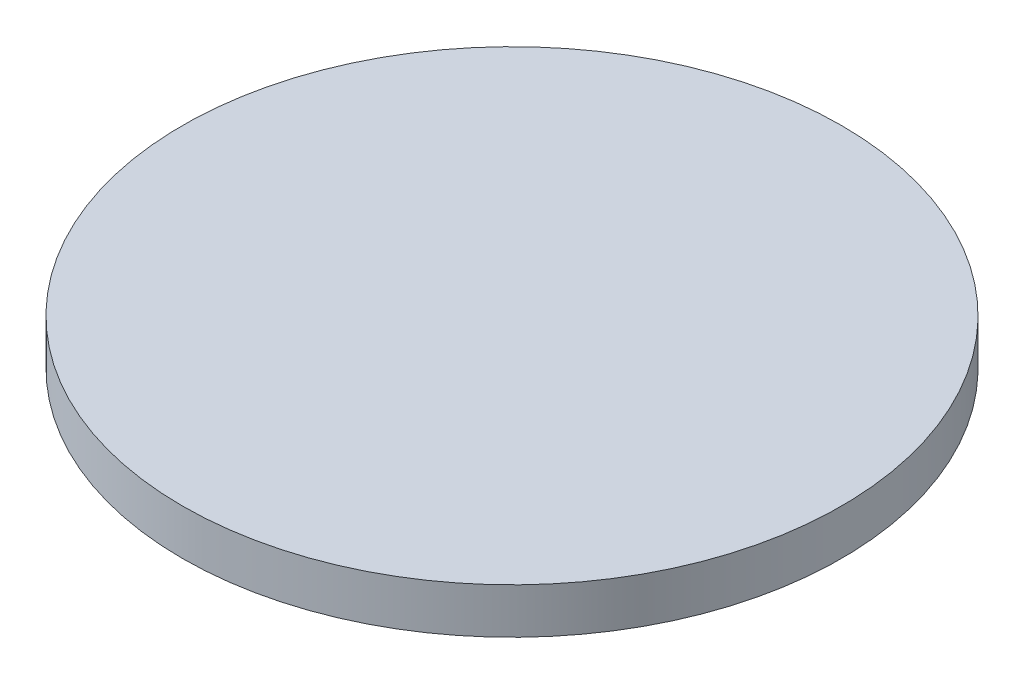
ISO-10303-21;
HEADER;
FILE_DESCRIPTION(('STEP AP214'),'2;1');
FILE_NAME('part.step','',(''),(''),'','','');
FILE_SCHEMA(('AUTOMOTIVE_DESIGN { 1 0 10303 214 1 1 1 1 }'));
ENDSEC;
DATA;
#1=APPLICATION_CONTEXT('core data for automotive mechanical design processes');
#2=APPLICATION_PROTOCOL_DEFINITION('international standard','automotive_design',2000,#1);
#3=PRODUCT_CONTEXT('',#1,'mechanical');
#4=PRODUCT('Part','Part','',(#3));
#5=PRODUCT_RELATED_PRODUCT_CATEGORY('part','',(#4));
#6=PRODUCT_DEFINITION_FORMATION('','',#4);
#7=PRODUCT_DEFINITION_CONTEXT('part definition',#1,'design');
#8=PRODUCT_DEFINITION('design','',#6,#7);
#9=PRODUCT_DEFINITION_SHAPE('','',#8);
#10=(LENGTH_UNIT() NAMED_UNIT(*) SI_UNIT(.MILLI.,.METRE.));
#11=(NAMED_UNIT(*) PLANE_ANGLE_UNIT() SI_UNIT($,.RADIAN.));
#12=(NAMED_UNIT(*) SI_UNIT($,.STERADIAN.) SOLID_ANGLE_UNIT());
#13=UNCERTAINTY_MEASURE_WITH_UNIT(LENGTH_MEASURE(1.E-05),#10,'distance_accuracy_value','');
#14=(GEOMETRIC_REPRESENTATION_CONTEXT(3) GLOBAL_UNCERTAINTY_ASSIGNED_CONTEXT((#13)) GLOBAL_UNIT_ASSIGNED_CONTEXT((#10,
#11,#12)) REPRESENTATION_CONTEXT('',''));
#15=CARTESIAN_POINT('',(0.,0.,0.));
#16=DIRECTION('',(0.,0.,1.));
#17=DIRECTION('',(1.,0.,0.));
#18=AXIS2_PLACEMENT_3D('',#15,#16,#17);
#19=CARTESIAN_POINT('',(0.,5.,0.));
#20=DIRECTION('',(0.,-1.,0.));
#21=DIRECTION('',(0.,0.,-1.));
#22=AXIS2_PLACEMENT_3D('',#19,#20,#21);
#23=CYLINDRICAL_SURFACE('',#22,36.25);
#24=CARTESIAN_POINT('',(0.,5.,0.));
#25=DIRECTION('',(0.,1.,0.));
#26=DIRECTION('',(0.,0.,1.));
#27=AXIS2_PLACEMENT_3D('',#24,#25,#26);
#28=CIRCLE('',#27,36.25);
#29=CARTESIAN_POINT('',(0.,5.,36.25));
#30=VERTEX_POINT('',#29);
#31=EDGE_CURVE('E10',#30,#30,#28,.T.);
#32=ORIENTED_EDGE('',*,*,#31,.F.);
#33=EDGE_LOOP('',(#32));
#34=FACE_BOUND('',#33,.T.);
#35=CARTESIAN_POINT('',(0.,0.,0.));
#36=DIRECTION('',(0.,1.,0.));
#37=DIRECTION('',(0.,0.,1.));
#38=AXIS2_PLACEMENT_3D('',#35,#36,#37);
#39=CIRCLE('',#38,36.25);
#40=CARTESIAN_POINT('',(0.,0.,36.25));
#41=VERTEX_POINT('',#40);
#42=EDGE_CURVE('E35',#41,#41,#39,.T.);
#43=ORIENTED_EDGE('',*,*,#42,.T.);
#44=EDGE_LOOP('',(#43));
#45=FACE_BOUND('',#44,.T.);
#46=ADVANCED_FACE('F32',(#34,#45),#23,.T.);
#47=CARTESIAN_POINT('',(0.,5.,0.));
#48=DIRECTION('',(0.,1.,0.));
#49=DIRECTION('',(0.,0.,1.));
#50=AXIS2_PLACEMENT_3D('',#47,#48,#49);
#51=PLANE('',#50);
#52=ORIENTED_EDGE('',*,*,#31,.T.);
#53=EDGE_LOOP('',(#52));
#54=FACE_BOUND('',#53,.T.);
#55=ADVANCED_FACE('F47',(#54),#51,.T.);
#56=CARTESIAN_POINT('',(0.,0.,0.));
#57=DIRECTION('',(0.,1.,0.));
#58=DIRECTION('',(0.,0.,1.));
#59=AXIS2_PLACEMENT_3D('',#56,#57,#58);
#60=PLANE('',#59);
#61=ORIENTED_EDGE('',*,*,#42,.F.);
#62=EDGE_LOOP('',(#61));
#63=FACE_BOUND('',#62,.T.);
#64=ADVANCED_FACE('F45',(#63),#60,.F.);
#65=CLOSED_SHELL('',(#46,#55,#64));
#66=MANIFOLD_SOLID_BREP('B2',#65);
#67=ADVANCED_BREP_SHAPE_REPRESENTATION('',(#18,#66),#14);
#68=SHAPE_DEFINITION_REPRESENTATION(#9,#67);
ENDSEC;
END-ISO-10303-21;
